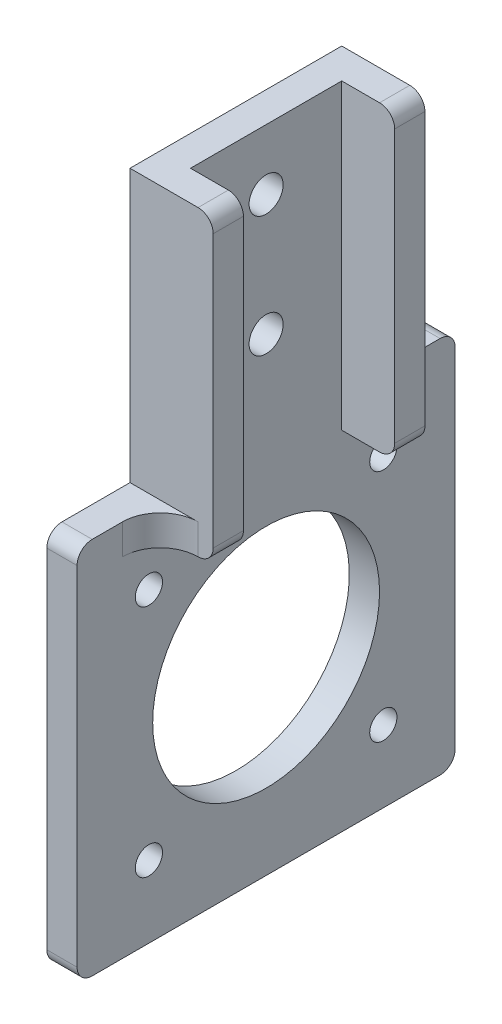
ISO-10303-21;
HEADER;
FILE_DESCRIPTION(('STEP AP214'),'2;1');
FILE_NAME('part.step','',(''),(''),'','','');
FILE_SCHEMA(('AUTOMOTIVE_DESIGN { 1 0 10303 214 1 1 1 1 }'));
ENDSEC;
DATA;
#1=APPLICATION_CONTEXT('core data for automotive mechanical design processes');
#2=APPLICATION_PROTOCOL_DEFINITION('international standard','automotive_design',2000,#1);
#3=PRODUCT_CONTEXT('',#1,'mechanical');
#4=PRODUCT('Part','Part','',(#3));
#5=PRODUCT_RELATED_PRODUCT_CATEGORY('part','',(#4));
#6=PRODUCT_DEFINITION_FORMATION('','',#4);
#7=PRODUCT_DEFINITION_CONTEXT('part definition',#1,'design');
#8=PRODUCT_DEFINITION('design','',#6,#7);
#9=PRODUCT_DEFINITION_SHAPE('','',#8);
#10=(LENGTH_UNIT() NAMED_UNIT(*) SI_UNIT(.MILLI.,.METRE.));
#11=(NAMED_UNIT(*) PLANE_ANGLE_UNIT() SI_UNIT($,.RADIAN.));
#12=(NAMED_UNIT(*) SI_UNIT($,.STERADIAN.) SOLID_ANGLE_UNIT());
#13=UNCERTAINTY_MEASURE_WITH_UNIT(LENGTH_MEASURE(1.E-05),#10,'distance_accuracy_value','');
#14=(GEOMETRIC_REPRESENTATION_CONTEXT(3) GLOBAL_UNCERTAINTY_ASSIGNED_CONTEXT((#13)) GLOBAL_UNIT_ASSIGNED_CONTEXT((#10,
#11,#12)) REPRESENTATION_CONTEXT('',''));
#15=CARTESIAN_POINT('',(0.,0.,0.));
#16=DIRECTION('',(0.,0.,1.));
#17=DIRECTION('',(1.,0.,0.));
#18=AXIS2_PLACEMENT_3D('',#15,#16,#17);
#19=CARTESIAN_POINT('',(0.,0.,0.));
#20=DIRECTION('',(0.,1.,0.));
#21=DIRECTION('',(0.,0.,1.));
#22=AXIS2_PLACEMENT_3D('',#19,#20,#21);
#23=PLANE('',#22);
#24=DIRECTION('',(0.,0.,1.));
#25=VECTOR('',#24,1.);
#26=CARTESIAN_POINT('',(-9.99999999999999,0.,0.));
#27=LINE('',#26,#25);
#28=CARTESIAN_POINT('',(-10.,0.,-19.));
#29=VERTEX_POINT('',#28);
#30=CARTESIAN_POINT('',(-10.,0.,-10.));
#31=VERTEX_POINT('',#30);
#32=EDGE_CURVE('E232',#29,#31,#27,.T.);
#33=ORIENTED_EDGE('',*,*,#32,.F.);
#34=CARTESIAN_POINT('',(-5.,0.,-19.));
#35=DIRECTION('',(0.,1.,0.));
#36=DIRECTION('',(0.,0.,1.));
#37=AXIS2_PLACEMENT_3D('',#34,#35,#36);
#38=CIRCLE('',#37,5.);
#39=CARTESIAN_POINT('',(-5.00000000000001,0.,-14.));
#40=VERTEX_POINT('',#39);
#41=EDGE_CURVE('E420',#29,#40,#38,.T.);
#42=ORIENTED_EDGE('',*,*,#41,.T.);
#43=DIRECTION('',(0.,0.,-1.));
#44=VECTOR('',#43,1.);
#45=CARTESIAN_POINT('',(-5.00000000000001,0.,0.));
#46=LINE('',#45,#44);
#47=CARTESIAN_POINT('',(-5.00000000000001,0.,-10.));
#48=VERTEX_POINT('',#47);
#49=EDGE_CURVE('E316',#40,#48,#46,.F.);
#50=ORIENTED_EDGE('',*,*,#49,.T.);
#51=DIRECTION('',(-1.,0.,0.));
#52=VECTOR('',#51,1.);
#53=CARTESIAN_POINT('',(-10.,0.,-10.));
#54=LINE('',#53,#52);
#55=EDGE_CURVE('E212',#48,#31,#54,.T.);
#56=ORIENTED_EDGE('',*,*,#55,.T.);
#57=EDGE_LOOP('',(#33,#42,#50,#56));
#58=FACE_BOUND('',#57,.T.);
#59=ADVANCED_FACE('F43',(#58),#23,.F.);
#60=CARTESIAN_POINT('',(-14.,40.,-14.));
#61=DIRECTION('',(0.,0.,1.));
#62=DIRECTION('',(1.,0.,0.));
#63=AXIS2_PLACEMENT_3D('',#60,#61,#62);
#64=PLANE('',#63);
#65=CARTESIAN_POINT('',(-5.,2.,-14.));
#66=DIRECTION('',(0.,0.,1.));
#67=DIRECTION('',(1.,0.,0.));
#68=AXIS2_PLACEMENT_3D('',#65,#66,#67);
#69=CIRCLE('',#68,2.);
#70=CARTESIAN_POINT('',(-3.,2.,-14.));
#71=VERTEX_POINT('',#70);
#72=EDGE_CURVE('E312',#71,#40,#69,.F.);
#73=ORIENTED_EDGE('',*,*,#72,.T.);
#74=DIRECTION('',(0.,-1.,0.));
#75=VECTOR('',#74,1.);
#76=CARTESIAN_POINT('',(-5.,40.,-14.));
#77=LINE('',#76,#75);
#78=CARTESIAN_POINT('',(-5.,4.,-14.));
#79=VERTEX_POINT('',#78);
#80=EDGE_CURVE('E414',#40,#79,#77,.F.);
#81=ORIENTED_EDGE('',*,*,#80,.T.);
#82=DIRECTION('',(-1.,0.,0.));
#83=VECTOR('',#82,1.);
#84=CARTESIAN_POINT('',(60.7106781186548,4.,-14.));
#85=LINE('',#84,#83);
#86=CARTESIAN_POINT('',(-14.,4.,-14.));
#87=VERTEX_POINT('',#86);
#88=EDGE_CURVE('E67',#79,#87,#85,.T.);
#89=ORIENTED_EDGE('',*,*,#88,.T.);
#90=DIRECTION('',(0.,-1.,0.));
#91=VECTOR('',#90,1.);
#92=CARTESIAN_POINT('',(-14.,40.,-14.));
#93=LINE('',#92,#91);
#94=CARTESIAN_POINT('',(-14.,40.,-14.));
#95=VERTEX_POINT('',#94);
#96=EDGE_CURVE('E288',#95,#87,#93,.T.);
#97=ORIENTED_EDGE('',*,*,#96,.F.);
#98=DIRECTION('',(-1.,0.,0.));
#99=VECTOR('',#98,1.);
#100=CARTESIAN_POINT('',(-14.,40.,-14.));
#101=LINE('',#100,#99);
#102=CARTESIAN_POINT('',(-5.00000000000001,40.,-14.));
#103=VERTEX_POINT('',#102);
#104=EDGE_CURVE('E275',#103,#95,#101,.T.);
#105=ORIENTED_EDGE('',*,*,#104,.F.);
#106=CARTESIAN_POINT('',(-5.,38.,-14.));
#107=DIRECTION('',(0.,0.,1.));
#108=DIRECTION('',(1.,0.,0.));
#109=AXIS2_PLACEMENT_3D('',#106,#107,#108);
#110=CIRCLE('',#109,2.);
#111=CARTESIAN_POINT('',(-3.,38.,-14.));
#112=VERTEX_POINT('',#111);
#113=EDGE_CURVE('E309',#103,#112,#110,.F.);
#114=ORIENTED_EDGE('',*,*,#113,.T.);
#115=DIRECTION('',(0.,-1.,0.));
#116=VECTOR('',#115,1.);
#117=CARTESIAN_POINT('',(-3.,40.,-14.));
#118=LINE('',#117,#116);
#119=EDGE_CURVE('E455',#112,#71,#118,.T.);
#120=ORIENTED_EDGE('',*,*,#119,.T.);
#121=EDGE_LOOP('',(#73,#81,#89,#97,#105,#114,#120));
#122=FACE_BOUND('',#121,.T.);
#123=ADVANCED_FACE('F566',(#122),#64,.F.);
#124=CARTESIAN_POINT('',(-14.,40.,14.));
#125=DIRECTION('',(0.,0.,-1.));
#126=DIRECTION('',(-1.,0.,0.));
#127=AXIS2_PLACEMENT_3D('',#124,#125,#126);
#128=PLANE('',#127);
#129=DIRECTION('',(-1.,0.,0.));
#130=VECTOR('',#129,1.);
#131=CARTESIAN_POINT('',(60.7106781186548,4.,14.));
#132=LINE('',#131,#130);
#133=CARTESIAN_POINT('',(-5.,4.,14.));
#134=VERTEX_POINT('',#133);
#135=CARTESIAN_POINT('',(-14.,4.,14.));
#136=VERTEX_POINT('',#135);
#137=EDGE_CURVE('E59',#134,#136,#132,.T.);
#138=ORIENTED_EDGE('',*,*,#137,.F.);
#139=DIRECTION('',(0.,1.,0.));
#140=VECTOR('',#139,1.);
#141=CARTESIAN_POINT('',(-5.,40.,14.));
#142=LINE('',#141,#140);
#143=CARTESIAN_POINT('',(-5.00000000000001,0.,14.));
#144=VERTEX_POINT('',#143);
#145=EDGE_CURVE('E417',#134,#144,#142,.F.);
#146=ORIENTED_EDGE('',*,*,#145,.T.);
#147=CARTESIAN_POINT('',(-5.00000000000001,2.,14.));
#148=DIRECTION('',(0.,0.,-1.));
#149=DIRECTION('',(-1.,0.,0.));
#150=AXIS2_PLACEMENT_3D('',#147,#148,#149);
#151=CIRCLE('',#150,2.);
#152=CARTESIAN_POINT('',(-3.00000000000001,2.,14.));
#153=VERTEX_POINT('',#152);
#154=EDGE_CURVE('E343',#144,#153,#151,.F.);
#155=ORIENTED_EDGE('',*,*,#154,.T.);
#156=DIRECTION('',(0.,-1.,0.));
#157=VECTOR('',#156,1.);
#158=CARTESIAN_POINT('',(-3.00000000000001,40.,14.));
#159=LINE('',#158,#157);
#160=CARTESIAN_POINT('',(-3.00000000000001,38.,14.));
#161=VERTEX_POINT('',#160);
#162=EDGE_CURVE('E443',#161,#153,#159,.T.);
#163=ORIENTED_EDGE('',*,*,#162,.F.);
#164=CARTESIAN_POINT('',(-5.00000000000001,38.,14.));
#165=DIRECTION('',(0.,0.,-1.));
#166=DIRECTION('',(-1.,0.,0.));
#167=AXIS2_PLACEMENT_3D('',#164,#165,#166);
#168=CIRCLE('',#167,2.);
#169=CARTESIAN_POINT('',(-5.00000000000001,40.,14.));
#170=VERTEX_POINT('',#169);
#171=EDGE_CURVE('E340',#161,#170,#168,.F.);
#172=ORIENTED_EDGE('',*,*,#171,.T.);
#173=DIRECTION('',(1.,0.,0.));
#174=VECTOR('',#173,1.);
#175=CARTESIAN_POINT('',(-14.,40.,14.));
#176=LINE('',#175,#174);
#177=CARTESIAN_POINT('',(-14.,40.,14.));
#178=VERTEX_POINT('',#177);
#179=EDGE_CURVE('E281',#178,#170,#176,.T.);
#180=ORIENTED_EDGE('',*,*,#179,.F.);
#181=DIRECTION('',(0.,-1.,0.));
#182=VECTOR('',#181,1.);
#183=CARTESIAN_POINT('',(-14.,40.,14.));
#184=LINE('',#183,#182);
#185=EDGE_CURVE('E285',#178,#136,#184,.T.);
#186=ORIENTED_EDGE('',*,*,#185,.T.);
#187=EDGE_LOOP('',(#138,#146,#155,#163,#172,#180,#186));
#188=FACE_BOUND('',#187,.T.);
#189=ADVANCED_FACE('F433',(#188),#128,.F.);
#190=CARTESIAN_POINT('',(0.,40.,0.));
#191=DIRECTION('',(0.,1.,0.));
#192=DIRECTION('',(0.,0.,1.));
#193=AXIS2_PLACEMENT_3D('',#190,#191,#192);
#194=PLANE('',#193);
#195=DIRECTION('',(-1.,0.,0.));
#196=VECTOR('',#195,1.);
#197=CARTESIAN_POINT('',(-10.,40.,-10.));
#198=LINE('',#197,#196);
#199=CARTESIAN_POINT('',(-5.00000000000001,40.,-10.));
#200=VERTEX_POINT('',#199);
#201=CARTESIAN_POINT('',(-10.,40.,-10.));
#202=VERTEX_POINT('',#201);
#203=EDGE_CURVE('E211',#200,#202,#198,.T.);
#204=ORIENTED_EDGE('',*,*,#203,.F.);
#205=DIRECTION('',(0.,0.,-1.));
#206=VECTOR('',#205,1.);
#207=CARTESIAN_POINT('',(-5.,40.,-14.));
#208=LINE('',#207,#206);
#209=EDGE_CURVE('E350',#200,#103,#208,.T.);
#210=ORIENTED_EDGE('',*,*,#209,.T.);
#211=ORIENTED_EDGE('',*,*,#104,.T.);
#212=DIRECTION('',(0.,0.,1.));
#213=VECTOR('',#212,1.);
#214=CARTESIAN_POINT('',(-14.,40.,-14.));
#215=LINE('',#214,#213);
#216=EDGE_CURVE('E278',#95,#178,#215,.T.);
#217=ORIENTED_EDGE('',*,*,#216,.T.);
#218=ORIENTED_EDGE('',*,*,#179,.T.);
#219=DIRECTION('',(0.,0.,-1.));
#220=VECTOR('',#219,1.);
#221=CARTESIAN_POINT('',(-5.00000000000001,40.,10.));
#222=LINE('',#221,#220);
#223=CARTESIAN_POINT('',(-5.00000000000001,40.,10.));
#224=VERTEX_POINT('',#223);
#225=EDGE_CURVE('E346',#170,#224,#222,.T.);
#226=ORIENTED_EDGE('',*,*,#225,.T.);
#227=DIRECTION('',(1.,0.,0.));
#228=VECTOR('',#227,1.);
#229=CARTESIAN_POINT('',(-10.,40.,10.));
#230=LINE('',#229,#228);
#231=CARTESIAN_POINT('',(-10.,40.,10.));
#232=VERTEX_POINT('',#231);
#233=EDGE_CURVE('E226',#232,#224,#230,.T.);
#234=ORIENTED_EDGE('',*,*,#233,.F.);
#235=DIRECTION('',(0.,0.,1.));
#236=VECTOR('',#235,1.);
#237=CARTESIAN_POINT('',(-10.,40.,10.));
#238=LINE('',#237,#236);
#239=EDGE_CURVE('E222',#202,#232,#238,.T.);
#240=ORIENTED_EDGE('',*,*,#239,.F.);
#241=EDGE_LOOP('',(#204,#210,#211,#217,#218,#226,#234,#240));
#242=FACE_BOUND('',#241,.T.);
#243=ADVANCED_FACE('F450',(#242),#194,.T.);
#244=DIRECTION('',(1.,0.,0.));
#245=VECTOR('',#244,1.);
#246=CARTESIAN_POINT('',(-10.,0.,10.));
#247=LINE('',#246,#245);
#248=CARTESIAN_POINT('',(-9.99999999999999,0.,10.));
#249=VERTEX_POINT('',#248);
#250=CARTESIAN_POINT('',(-5.00000000000001,0.,10.));
#251=VERTEX_POINT('',#250);
#252=EDGE_CURVE('E198',#249,#251,#247,.T.);
#253=ORIENTED_EDGE('',*,*,#252,.T.);
#254=DIRECTION('',(0.,0.,-1.));
#255=VECTOR('',#254,1.);
#256=CARTESIAN_POINT('',(-5.00000000000001,0.,0.));
#257=LINE('',#256,#255);
#258=EDGE_CURVE('E337',#251,#144,#257,.F.);
#259=ORIENTED_EDGE('',*,*,#258,.T.);
#260=CARTESIAN_POINT('',(-5.,0.,19.));
#261=DIRECTION('',(0.,1.,0.));
#262=DIRECTION('',(0.,0.,1.));
#263=AXIS2_PLACEMENT_3D('',#260,#261,#262);
#264=CIRCLE('',#263,5.);
#265=CARTESIAN_POINT('',(-9.99999999999999,0.,19.));
#266=VERTEX_POINT('',#265);
#267=EDGE_CURVE('E11',#144,#266,#264,.T.);
#268=ORIENTED_EDGE('',*,*,#267,.T.);
#269=EDGE_CURVE('E219',#249,#266,#27,.T.);
#270=ORIENTED_EDGE('',*,*,#269,.F.);
#271=EDGE_LOOP('',(#253,#259,#268,#270));
#272=FACE_BOUND('',#271,.T.);
#273=ADVANCED_FACE('F228',(#272),#23,.F.);
#274=CARTESIAN_POINT('',(-14.,40.,-14.));
#275=DIRECTION('',(1.,0.,0.));
#276=DIRECTION('',(0.,0.,-1.));
#277=AXIS2_PLACEMENT_3D('',#274,#275,#276);
#278=PLANE('',#277);
#279=CARTESIAN_POINT('',(-14.,16.,0.));
#280=DIRECTION('',(-1.,0.,0.));
#281=DIRECTION('',(0.,0.,1.));
#282=AXIS2_PLACEMENT_3D('',#279,#280,#281);
#283=CIRCLE('',#282,2.25);
#284=CARTESIAN_POINT('',(-14.,16.,2.25));
#285=VERTEX_POINT('',#284);
#286=EDGE_CURVE('E253',#285,#285,#283,.T.);
#287=ORIENTED_EDGE('',*,*,#286,.F.);
#288=EDGE_LOOP('',(#287));
#289=FACE_BOUND('',#288,.T.);
#290=CARTESIAN_POINT('',(-14.,32.,0.));
#291=DIRECTION('',(-1.,0.,0.));
#292=DIRECTION('',(0.,0.,1.));
#293=AXIS2_PLACEMENT_3D('',#290,#291,#292);
#294=CIRCLE('',#293,2.25);
#295=CARTESIAN_POINT('',(-14.,32.,2.25));
#296=VERTEX_POINT('',#295);
#297=EDGE_CURVE('E258',#296,#296,#294,.T.);
#298=ORIENTED_EDGE('',*,*,#297,.F.);
#299=EDGE_LOOP('',(#298));
#300=FACE_BOUND('',#299,.T.);
#301=DIRECTION('',(0.,1.,0.));
#302=VECTOR('',#301,1.);
#303=CARTESIAN_POINT('',(-14.,0.,25.));
#304=LINE('',#303,#302);
#305=CARTESIAN_POINT('',(-14.,-44.,25.));
#306=VERTEX_POINT('',#305);
#307=CARTESIAN_POINT('',(-14.,2.,25.));
#308=VERTEX_POINT('',#307);
#309=EDGE_CURVE('E240',#306,#308,#304,.T.);
#310=ORIENTED_EDGE('',*,*,#309,.T.);
#311=CARTESIAN_POINT('',(-14.,2.,23.));
#312=DIRECTION('',(1.,0.,0.));
#313=DIRECTION('',(0.,0.,-1.));
#314=AXIS2_PLACEMENT_3D('',#311,#312,#313);
#315=CIRCLE('',#314,2.);
#316=CARTESIAN_POINT('',(-14.,4.,23.));
#317=VERTEX_POINT('',#316);
#318=EDGE_CURVE('E370',#308,#317,#315,.F.);
#319=ORIENTED_EDGE('',*,*,#318,.T.);
#320=DIRECTION('',(0.,0.,1.));
#321=VECTOR('',#320,1.);
#322=CARTESIAN_POINT('',(-14.,4.,0.));
#323=LINE('',#322,#321);
#324=EDGE_CURVE('E247',#136,#317,#323,.T.);
#325=ORIENTED_EDGE('',*,*,#324,.F.);
#326=ORIENTED_EDGE('',*,*,#185,.F.);
#327=ORIENTED_EDGE('',*,*,#216,.F.);
#328=ORIENTED_EDGE('',*,*,#96,.T.);
#329=CARTESIAN_POINT('',(-14.,4.,-23.));
#330=VERTEX_POINT('',#329);
#331=EDGE_CURVE('E252',#330,#87,#323,.T.);
#332=ORIENTED_EDGE('',*,*,#331,.F.);
#333=CARTESIAN_POINT('',(-14.,2.,-23.));
#334=DIRECTION('',(1.,0.,0.));
#335=DIRECTION('',(0.,0.,-1.));
#336=AXIS2_PLACEMENT_3D('',#333,#334,#335);
#337=CIRCLE('',#336,2.);
#338=CARTESIAN_POINT('',(-14.,2.,-25.));
#339=VERTEX_POINT('',#338);
#340=EDGE_CURVE('E367',#330,#339,#337,.F.);
#341=ORIENTED_EDGE('',*,*,#340,.T.);
#342=DIRECTION('',(0.,1.,0.));
#343=VECTOR('',#342,1.);
#344=CARTESIAN_POINT('',(-14.,0.,-25.));
#345=LINE('',#344,#343);
#346=CARTESIAN_POINT('',(-14.,-44.,-25.));
#347=VERTEX_POINT('',#346);
#348=EDGE_CURVE('E487',#347,#339,#345,.T.);
#349=ORIENTED_EDGE('',*,*,#348,.F.);
#350=CARTESIAN_POINT('',(-14.,-44.,-23.));
#351=DIRECTION('',(1.,0.,0.));
#352=DIRECTION('',(0.,0.,-1.));
#353=AXIS2_PLACEMENT_3D('',#350,#351,#352);
#354=CIRCLE('',#353,2.);
#355=CARTESIAN_POINT('',(-14.,-46.,-23.));
#356=VERTEX_POINT('',#355);
#357=EDGE_CURVE('E364',#347,#356,#354,.F.);
#358=ORIENTED_EDGE('',*,*,#357,.T.);
#359=DIRECTION('',(0.,0.,1.));
#360=VECTOR('',#359,1.);
#361=CARTESIAN_POINT('',(-14.,-46.,0.));
#362=LINE('',#361,#360);
#363=CARTESIAN_POINT('',(-14.,-46.,23.));
#364=VERTEX_POINT('',#363);
#365=EDGE_CURVE('E468',#356,#364,#362,.T.);
#366=ORIENTED_EDGE('',*,*,#365,.T.);
#367=CARTESIAN_POINT('',(-14.,-44.,23.));
#368=DIRECTION('',(1.,0.,0.));
#369=DIRECTION('',(0.,0.,-1.));
#370=AXIS2_PLACEMENT_3D('',#367,#368,#369);
#371=CIRCLE('',#370,2.);
#372=EDGE_CURVE('E361',#364,#306,#371,.F.);
#373=ORIENTED_EDGE('',*,*,#372,.T.);
#374=EDGE_LOOP('',(#310,#319,#325,#326,#327,#328,#332,#341,#349,#358,#366,#373));
#375=FACE_BOUND('',#374,.T.);
#376=CARTESIAN_POINT('',(-14.,-21.,0.));
#377=DIRECTION('',(-1.,0.,0.));
#378=DIRECTION('',(0.,0.,1.));
#379=AXIS2_PLACEMENT_3D('',#376,#377,#378);
#380=CIRCLE('',#379,15.);
#381=CARTESIAN_POINT('',(-14.,-21.,15.));
#382=VERTEX_POINT('',#381);
#383=EDGE_CURVE('E469',#382,#382,#380,.T.);
#384=ORIENTED_EDGE('',*,*,#383,.F.);
#385=EDGE_LOOP('',(#384));
#386=FACE_BOUND('',#385,.T.);
#387=CARTESIAN_POINT('',(-14.,-36.4997806436091,-15.4997806436091));
#388=DIRECTION('',(-1.,0.,0.));
#389=DIRECTION('',(0.,0.,1.));
#390=AXIS2_PLACEMENT_3D('',#387,#388,#389);
#391=CIRCLE('',#390,1.8);
#392=CARTESIAN_POINT('',(-14.,-36.4997806436091,-13.6997806436091));
#393=VERTEX_POINT('',#392);
#394=EDGE_CURVE('E477',#393,#393,#391,.T.);
#395=ORIENTED_EDGE('',*,*,#394,.F.);
#396=EDGE_LOOP('',(#395));
#397=FACE_BOUND('',#396,.T.);
#398=CARTESIAN_POINT('',(-14.,-36.4997806436091,15.4997806436091));
#399=DIRECTION('',(-1.,0.,0.));
#400=DIRECTION('',(0.,0.,1.));
#401=AXIS2_PLACEMENT_3D('',#398,#399,#400);
#402=CIRCLE('',#401,1.8);
#403=CARTESIAN_POINT('',(-14.,-36.4997806436091,17.2997806436091));
#404=VERTEX_POINT('',#403);
#405=EDGE_CURVE('E473',#404,#404,#402,.T.);
#406=ORIENTED_EDGE('',*,*,#405,.F.);
#407=EDGE_LOOP('',(#406));
#408=FACE_BOUND('',#407,.T.);
#409=CARTESIAN_POINT('',(-14.,-5.50021935639087,15.4997806436091));
#410=DIRECTION('',(-1.,0.,0.));
#411=DIRECTION('',(0.,0.,1.));
#412=AXIS2_PLACEMENT_3D('',#409,#410,#411);
#413=CIRCLE('',#412,1.8);
#414=CARTESIAN_POINT('',(-14.,-5.50021935639087,17.2997806436091));
#415=VERTEX_POINT('',#414);
#416=EDGE_CURVE('E251',#415,#415,#413,.T.);
#417=ORIENTED_EDGE('',*,*,#416,.F.);
#418=EDGE_LOOP('',(#417));
#419=FACE_BOUND('',#418,.T.);
#420=CARTESIAN_POINT('',(-14.,-5.50021935639087,-15.4997806436091));
#421=DIRECTION('',(-1.,0.,0.));
#422=DIRECTION('',(0.,0.,1.));
#423=AXIS2_PLACEMENT_3D('',#420,#421,#422);
#424=CIRCLE('',#423,1.8);
#425=CARTESIAN_POINT('',(-14.,-5.50021935639087,-13.6997806436091));
#426=VERTEX_POINT('',#425);
#427=EDGE_CURVE('E464',#426,#426,#424,.T.);
#428=ORIENTED_EDGE('',*,*,#427,.F.);
#429=EDGE_LOOP('',(#428));
#430=FACE_BOUND('',#429,.T.);
#431=ADVANCED_FACE('F544',(#289,#300,#375,#386,#397,#408,#419,#430),#278,.F.);
#432=CARTESIAN_POINT('',(-10.,40.,-10.));
#433=DIRECTION('',(0.,0.,1.));
#434=DIRECTION('',(1.,0.,0.));
#435=AXIS2_PLACEMENT_3D('',#432,#433,#434);
#436=PLANE('',#435);
#437=ORIENTED_EDGE('',*,*,#55,.F.);
#438=CARTESIAN_POINT('',(-5.00000000000001,2.,-10.));
#439=DIRECTION('',(0.,0.,1.));
#440=DIRECTION('',(1.,0.,0.));
#441=AXIS2_PLACEMENT_3D('',#438,#439,#440);
#442=CIRCLE('',#441,2.);
#443=CARTESIAN_POINT('',(-3.00000000000001,2.,-10.));
#444=VERTEX_POINT('',#443);
#445=EDGE_CURVE('E322',#48,#444,#442,.T.);
#446=ORIENTED_EDGE('',*,*,#445,.T.);
#447=DIRECTION('',(0.,-1.,0.));
#448=VECTOR('',#447,1.);
#449=CARTESIAN_POINT('',(-3.00000000000001,40.,-10.));
#450=LINE('',#449,#448);
#451=CARTESIAN_POINT('',(-3.00000000000001,38.,-10.));
#452=VERTEX_POINT('',#451);
#453=EDGE_CURVE('E248',#452,#444,#450,.T.);
#454=ORIENTED_EDGE('',*,*,#453,.F.);
#455=CARTESIAN_POINT('',(-5.00000000000001,38.,-10.));
#456=DIRECTION('',(0.,0.,1.));
#457=DIRECTION('',(1.,0.,0.));
#458=AXIS2_PLACEMENT_3D('',#455,#456,#457);
#459=CIRCLE('',#458,2.);
#460=EDGE_CURVE('E319',#452,#200,#459,.T.);
#461=ORIENTED_EDGE('',*,*,#460,.T.);
#462=ORIENTED_EDGE('',*,*,#203,.T.);
#463=DIRECTION('',(0.,-1.,0.));
#464=VECTOR('',#463,1.);
#465=CARTESIAN_POINT('',(-10.,40.,-10.));
#466=LINE('',#465,#464);
#467=EDGE_CURVE('E225',#202,#31,#466,.T.);
#468=ORIENTED_EDGE('',*,*,#467,.T.);
#469=EDGE_LOOP('',(#437,#446,#454,#461,#462,#468));
#470=FACE_BOUND('',#469,.T.);
#471=ADVANCED_FACE('F578',(#470),#436,.T.);
#472=CARTESIAN_POINT('',(-10.,40.,10.));
#473=DIRECTION('',(1.,0.,0.));
#474=DIRECTION('',(0.,0.,-1.));
#475=AXIS2_PLACEMENT_3D('',#472,#473,#474);
#476=PLANE('',#475);
#477=CARTESIAN_POINT('',(-10.,16.,0.));
#478=DIRECTION('',(1.,0.,0.));
#479=DIRECTION('',(0.,0.,-1.));
#480=AXIS2_PLACEMENT_3D('',#477,#478,#479);
#481=CIRCLE('',#480,2.25);
#482=CARTESIAN_POINT('',(-10.,16.,-2.25));
#483=VERTEX_POINT('',#482);
#484=EDGE_CURVE('E270',#483,#483,#481,.T.);
#485=ORIENTED_EDGE('',*,*,#484,.F.);
#486=EDGE_LOOP('',(#485));
#487=FACE_BOUND('',#486,.T.);
#488=CARTESIAN_POINT('',(-10.,32.,0.));
#489=DIRECTION('',(1.,0.,0.));
#490=DIRECTION('',(0.,0.,-1.));
#491=AXIS2_PLACEMENT_3D('',#488,#489,#490);
#492=CIRCLE('',#491,2.25);
#493=CARTESIAN_POINT('',(-10.,32.,-2.25));
#494=VERTEX_POINT('',#493);
#495=EDGE_CURVE('E257',#494,#494,#492,.T.);
#496=ORIENTED_EDGE('',*,*,#495,.F.);
#497=EDGE_LOOP('',(#496));
#498=FACE_BOUND('',#497,.T.);
#499=DIRECTION('',(0.,0.,1.));
#500=VECTOR('',#499,1.);
#501=CARTESIAN_POINT('',(-9.99999999999999,4.,0.));
#502=LINE('',#501,#500);
#503=CARTESIAN_POINT('',(-10.,4.,-23.));
#504=VERTEX_POINT('',#503);
#505=CARTESIAN_POINT('',(-10.,4.,-19.));
#506=VERTEX_POINT('',#505);
#507=EDGE_CURVE('E511',#504,#506,#502,.T.);
#508=ORIENTED_EDGE('',*,*,#507,.T.);
#509=DIRECTION('',(0.,-1.,0.));
#510=VECTOR('',#509,1.);
#511=CARTESIAN_POINT('',(-10.,40.,-19.));
#512=LINE('',#511,#510);
#513=EDGE_CURVE('E410',#506,#29,#512,.T.);
#514=ORIENTED_EDGE('',*,*,#513,.T.);
#515=ORIENTED_EDGE('',*,*,#32,.T.);
#516=ORIENTED_EDGE('',*,*,#467,.F.);
#517=ORIENTED_EDGE('',*,*,#239,.T.);
#518=DIRECTION('',(0.,-1.,0.));
#519=VECTOR('',#518,1.);
#520=CARTESIAN_POINT('',(-10.,40.,10.));
#521=LINE('',#520,#519);
#522=EDGE_CURVE('E203',#232,#249,#521,.T.);
#523=ORIENTED_EDGE('',*,*,#522,.T.);
#524=ORIENTED_EDGE('',*,*,#269,.T.);
#525=DIRECTION('',(0.,1.,0.));
#526=VECTOR('',#525,1.);
#527=CARTESIAN_POINT('',(-10.,40.,19.));
#528=LINE('',#527,#526);
#529=CARTESIAN_POINT('',(-9.99999999999999,4.,19.));
#530=VERTEX_POINT('',#529);
#531=EDGE_CURVE('E407',#266,#530,#528,.T.);
#532=ORIENTED_EDGE('',*,*,#531,.T.);
#533=DIRECTION('',(0.,0.,1.));
#534=VECTOR('',#533,1.);
#535=CARTESIAN_POINT('',(-9.99999999999999,4.,0.));
#536=LINE('',#535,#534);
#537=CARTESIAN_POINT('',(-9.99999999999999,4.,23.));
#538=VERTEX_POINT('',#537);
#539=EDGE_CURVE('E238',#530,#538,#536,.T.);
#540=ORIENTED_EDGE('',*,*,#539,.T.);
#541=CARTESIAN_POINT('',(-10.,2.,23.));
#542=DIRECTION('',(1.,0.,0.));
#543=DIRECTION('',(0.,0.,-1.));
#544=AXIS2_PLACEMENT_3D('',#541,#542,#543);
#545=CIRCLE('',#544,2.);
#546=CARTESIAN_POINT('',(-10.,2.,25.));
#547=VERTEX_POINT('',#546);
#548=EDGE_CURVE('E386',#538,#547,#545,.T.);
#549=ORIENTED_EDGE('',*,*,#548,.T.);
#550=DIRECTION('',(0.,1.,0.));
#551=VECTOR('',#550,1.);
#552=CARTESIAN_POINT('',(-10.,0.,25.));
#553=LINE('',#552,#551);
#554=CARTESIAN_POINT('',(-10.,-44.,25.));
#555=VERTEX_POINT('',#554);
#556=EDGE_CURVE('E521',#555,#547,#553,.T.);
#557=ORIENTED_EDGE('',*,*,#556,.F.);
#558=CARTESIAN_POINT('',(-9.99999999999999,-44.,23.));
#559=DIRECTION('',(1.,0.,0.));
#560=DIRECTION('',(0.,0.,-1.));
#561=AXIS2_PLACEMENT_3D('',#558,#559,#560);
#562=CIRCLE('',#561,2.);
#563=CARTESIAN_POINT('',(-9.99999999999999,-46.,23.));
#564=VERTEX_POINT('',#563);
#565=EDGE_CURVE('E377',#555,#564,#562,.T.);
#566=ORIENTED_EDGE('',*,*,#565,.T.);
#567=DIRECTION('',(0.,0.,1.));
#568=VECTOR('',#567,1.);
#569=CARTESIAN_POINT('',(-9.99999999999999,-46.,0.));
#570=LINE('',#569,#568);
#571=CARTESIAN_POINT('',(-10.,-46.,-23.));
#572=VERTEX_POINT('',#571);
#573=EDGE_CURVE('E491',#572,#564,#570,.T.);
#574=ORIENTED_EDGE('',*,*,#573,.F.);
#575=CARTESIAN_POINT('',(-9.99999999999999,-44.,-23.));
#576=DIRECTION('',(1.,0.,0.));
#577=DIRECTION('',(0.,0.,-1.));
#578=AXIS2_PLACEMENT_3D('',#575,#576,#577);
#579=CIRCLE('',#578,2.);
#580=CARTESIAN_POINT('',(-9.99999999999999,-44.,-25.));
#581=VERTEX_POINT('',#580);
#582=EDGE_CURVE('E380',#572,#581,#579,.T.);
#583=ORIENTED_EDGE('',*,*,#582,.T.);
#584=DIRECTION('',(0.,1.,0.));
#585=VECTOR('',#584,1.);
#586=CARTESIAN_POINT('',(-9.99999999999999,0.,-25.));
#587=LINE('',#586,#585);
#588=CARTESIAN_POINT('',(-9.99999999999999,2.,-25.));
#589=VERTEX_POINT('',#588);
#590=EDGE_CURVE('E515',#581,#589,#587,.T.);
#591=ORIENTED_EDGE('',*,*,#590,.T.);
#592=CARTESIAN_POINT('',(-9.99999999999999,2.,-23.));
#593=DIRECTION('',(1.,0.,0.));
#594=DIRECTION('',(0.,0.,-1.));
#595=AXIS2_PLACEMENT_3D('',#592,#593,#594);
#596=CIRCLE('',#595,2.);
#597=EDGE_CURVE('E383',#589,#504,#596,.T.);
#598=ORIENTED_EDGE('',*,*,#597,.T.);
#599=EDGE_LOOP('',(#508,#514,#515,#516,#517,#523,#524,#532,#540,#549,#557,#566,#574,#583,#591,#598));
#600=FACE_BOUND('',#599,.T.);
#601=CARTESIAN_POINT('',(-9.99999999999999,-36.4997806436091,15.4997806436091));
#602=DIRECTION('',(1.,0.,0.));
#603=DIRECTION('',(0.,0.,-1.));
#604=AXIS2_PLACEMENT_3D('',#601,#602,#603);
#605=CIRCLE('',#604,1.8);
#606=CARTESIAN_POINT('',(-9.99999999999999,-36.4997806436091,13.6997806436091));
#607=VERTEX_POINT('',#606);
#608=EDGE_CURVE('E233',#607,#607,#605,.F.);
#609=ORIENTED_EDGE('',*,*,#608,.T.);
#610=EDGE_LOOP('',(#609));
#611=FACE_BOUND('',#610,.T.);
#612=CARTESIAN_POINT('',(-9.99999999999999,-5.50021935639087,-15.4997806436091));
#613=DIRECTION('',(1.,0.,0.));
#614=DIRECTION('',(0.,0.,-1.));
#615=AXIS2_PLACEMENT_3D('',#612,#613,#614);
#616=CIRCLE('',#615,1.8);
#617=CARTESIAN_POINT('',(-9.99999999999999,-5.50021935639087,-17.2997806436091));
#618=VERTEX_POINT('',#617);
#619=EDGE_CURVE('E508',#618,#618,#616,.F.);
#620=ORIENTED_EDGE('',*,*,#619,.T.);
#621=EDGE_LOOP('',(#620));
#622=FACE_BOUND('',#621,.T.);
#623=CARTESIAN_POINT('',(-9.99999999999999,-21.,0.));
#624=DIRECTION('',(1.,0.,0.));
#625=DIRECTION('',(0.,0.,-1.));
#626=AXIS2_PLACEMENT_3D('',#623,#624,#625);
#627=CIRCLE('',#626,15.);
#628=CARTESIAN_POINT('',(-10.,-21.,-15.));
#629=VERTEX_POINT('',#628);
#630=EDGE_CURVE('E504',#629,#629,#627,.F.);
#631=ORIENTED_EDGE('',*,*,#630,.T.);
#632=EDGE_LOOP('',(#631));
#633=FACE_BOUND('',#632,.T.);
#634=CARTESIAN_POINT('',(-9.99999999999999,-36.4997806436091,-15.4997806436091));
#635=DIRECTION('',(1.,0.,0.));
#636=DIRECTION('',(0.,0.,-1.));
#637=AXIS2_PLACEMENT_3D('',#634,#635,#636);
#638=CIRCLE('',#637,1.8);
#639=CARTESIAN_POINT('',(-9.99999999999999,-36.4997806436091,-17.2997806436091));
#640=VERTEX_POINT('',#639);
#641=EDGE_CURVE('E500',#640,#640,#638,.F.);
#642=ORIENTED_EDGE('',*,*,#641,.T.);
#643=EDGE_LOOP('',(#642));
#644=FACE_BOUND('',#643,.T.);
#645=CARTESIAN_POINT('',(-9.99999999999999,-5.50021935639087,15.4997806436091));
#646=DIRECTION('',(1.,0.,0.));
#647=DIRECTION('',(0.,0.,-1.));
#648=AXIS2_PLACEMENT_3D('',#645,#646,#647);
#649=CIRCLE('',#648,1.8);
#650=CARTESIAN_POINT('',(-9.99999999999999,-5.50021935639087,13.6997806436091));
#651=VERTEX_POINT('',#650);
#652=EDGE_CURVE('E262',#651,#651,#649,.F.);
#653=ORIENTED_EDGE('',*,*,#652,.T.);
#654=EDGE_LOOP('',(#653));
#655=FACE_BOUND('',#654,.T.);
#656=ADVANCED_FACE('F216',(#487,#498,#600,#611,#622,#633,#644,#655),#476,.T.);
#657=CARTESIAN_POINT('',(-10.,40.,10.));
#658=DIRECTION('',(0.,0.,-1.));
#659=DIRECTION('',(-1.,0.,0.));
#660=AXIS2_PLACEMENT_3D('',#657,#658,#659);
#661=PLANE('',#660);
#662=DIRECTION('',(0.,1.,0.));
#663=VECTOR('',#662,1.);
#664=CARTESIAN_POINT('',(-3.00000000000001,40.,10.));
#665=LINE('',#664,#663);
#666=CARTESIAN_POINT('',(-3.00000000000001,2.,10.));
#667=VERTEX_POINT('',#666);
#668=CARTESIAN_POINT('',(-3.00000000000001,38.,10.));
#669=VERTEX_POINT('',#668);
#670=EDGE_CURVE('E292',#667,#669,#665,.T.);
#671=ORIENTED_EDGE('',*,*,#670,.F.);
#672=CARTESIAN_POINT('',(-5.00000000000001,2.,10.));
#673=DIRECTION('',(0.,0.,-1.));
#674=DIRECTION('',(-1.,0.,0.));
#675=AXIS2_PLACEMENT_3D('',#672,#673,#674);
#676=CIRCLE('',#675,2.);
#677=EDGE_CURVE('E205',#667,#251,#676,.T.);
#678=ORIENTED_EDGE('',*,*,#677,.T.);
#679=ORIENTED_EDGE('',*,*,#252,.F.);
#680=ORIENTED_EDGE('',*,*,#522,.F.);
#681=ORIENTED_EDGE('',*,*,#233,.T.);
#682=CARTESIAN_POINT('',(-5.00000000000001,38.,10.));
#683=DIRECTION('',(0.,0.,-1.));
#684=DIRECTION('',(-1.,0.,0.));
#685=AXIS2_PLACEMENT_3D('',#682,#683,#684);
#686=CIRCLE('',#685,2.);
#687=EDGE_CURVE('E332',#224,#669,#686,.T.);
#688=ORIENTED_EDGE('',*,*,#687,.T.);
#689=EDGE_LOOP('',(#671,#678,#679,#680,#681,#688));
#690=FACE_BOUND('',#689,.T.);
#691=ADVANCED_FACE('F201',(#690),#661,.T.);
#692=CARTESIAN_POINT('',(16.,32.,0.));
#693=DIRECTION('',(-1.,0.,0.));
#694=DIRECTION('',(0.,0.,1.));
#695=AXIS2_PLACEMENT_3D('',#692,#693,#694);
#696=CYLINDRICAL_SURFACE('',#695,2.25);
#697=ORIENTED_EDGE('',*,*,#495,.T.);
#698=EDGE_LOOP('',(#697));
#699=FACE_BOUND('',#698,.T.);
#700=ORIENTED_EDGE('',*,*,#297,.T.);
#701=EDGE_LOOP('',(#700));
#702=FACE_BOUND('',#701,.T.);
#703=ADVANCED_FACE('F625',(#699,#702),#696,.F.);
#704=CARTESIAN_POINT('',(16.,16.,0.));
#705=DIRECTION('',(-1.,0.,0.));
#706=DIRECTION('',(0.,0.,1.));
#707=AXIS2_PLACEMENT_3D('',#704,#705,#706);
#708=CYLINDRICAL_SURFACE('',#707,2.25);
#709=ORIENTED_EDGE('',*,*,#484,.T.);
#710=EDGE_LOOP('',(#709));
#711=FACE_BOUND('',#710,.T.);
#712=ORIENTED_EDGE('',*,*,#286,.T.);
#713=EDGE_LOOP('',(#712));
#714=FACE_BOUND('',#713,.T.);
#715=ADVANCED_FACE('F628',(#711,#714),#708,.F.);
#716=CARTESIAN_POINT('',(60.7106781186548,4.,0.));
#717=DIRECTION('',(0.,-1.,0.));
#718=DIRECTION('',(0.,0.,-1.));
#719=AXIS2_PLACEMENT_3D('',#716,#717,#718);
#720=PLANE('',#719);
#721=ORIENTED_EDGE('',*,*,#324,.T.);
#722=DIRECTION('',(-1.,0.,0.));
#723=VECTOR('',#722,1.);
#724=CARTESIAN_POINT('',(-10.,4.,23.));
#725=LINE('',#724,#723);
#726=EDGE_CURVE('E373',#317,#538,#725,.F.);
#727=ORIENTED_EDGE('',*,*,#726,.T.);
#728=ORIENTED_EDGE('',*,*,#539,.F.);
#729=CARTESIAN_POINT('',(-5.,4.,19.));
#730=DIRECTION('',(0.,-1.,0.));
#731=DIRECTION('',(0.,0.,-1.));
#732=AXIS2_PLACEMENT_3D('',#729,#730,#731);
#733=CIRCLE('',#732,5.);
#734=EDGE_CURVE('E52',#530,#134,#733,.T.);
#735=ORIENTED_EDGE('',*,*,#734,.T.);
#736=ORIENTED_EDGE('',*,*,#137,.T.);
#737=EDGE_LOOP('',(#721,#727,#728,#735,#736));
#738=FACE_BOUND('',#737,.T.);
#739=ADVANCED_FACE('F430',(#738),#720,.F.);
#740=CARTESIAN_POINT('',(60.7106781186548,0.,25.));
#741=DIRECTION('',(0.,0.,1.));
#742=DIRECTION('',(1.,0.,0.));
#743=AXIS2_PLACEMENT_3D('',#740,#741,#742);
#744=PLANE('',#743);
#745=ORIENTED_EDGE('',*,*,#556,.T.);
#746=DIRECTION('',(-1.,0.,0.));
#747=VECTOR('',#746,1.);
#748=CARTESIAN_POINT('',(-14.,2.,25.));
#749=LINE('',#748,#747);
#750=EDGE_CURVE('E357',#547,#308,#749,.T.);
#751=ORIENTED_EDGE('',*,*,#750,.T.);
#752=ORIENTED_EDGE('',*,*,#309,.F.);
#753=DIRECTION('',(-1.,0.,0.));
#754=VECTOR('',#753,1.);
#755=CARTESIAN_POINT('',(60.7106781186548,-44.,25.));
#756=LINE('',#755,#754);
#757=EDGE_CURVE('E354',#306,#555,#756,.F.);
#758=ORIENTED_EDGE('',*,*,#757,.T.);
#759=EDGE_LOOP('',(#745,#751,#752,#758));
#760=FACE_BOUND('',#759,.T.);
#761=ADVANCED_FACE('F642',(#760),#744,.T.);
#762=CARTESIAN_POINT('',(60.7106781186548,-46.,0.));
#763=DIRECTION('',(0.,-1.,0.));
#764=DIRECTION('',(0.,0.,-1.));
#765=AXIS2_PLACEMENT_3D('',#762,#763,#764);
#766=PLANE('',#765);
#767=ORIENTED_EDGE('',*,*,#365,.F.);
#768=DIRECTION('',(-1.,0.,0.));
#769=VECTOR('',#768,1.);
#770=CARTESIAN_POINT('',(-9.99999999999999,-46.,-23.));
#771=LINE('',#770,#769);
#772=EDGE_CURVE('E404',#356,#572,#771,.F.);
#773=ORIENTED_EDGE('',*,*,#772,.T.);
#774=ORIENTED_EDGE('',*,*,#573,.T.);
#775=DIRECTION('',(-1.,0.,0.));
#776=VECTOR('',#775,1.);
#777=CARTESIAN_POINT('',(60.7106781186548,-46.,23.));
#778=LINE('',#777,#776);
#779=EDGE_CURVE('E400',#564,#364,#778,.T.);
#780=ORIENTED_EDGE('',*,*,#779,.T.);
#781=EDGE_LOOP('',(#767,#773,#774,#780));
#782=FACE_BOUND('',#781,.T.);
#783=ADVANCED_FACE('F542',(#782),#766,.T.);
#784=CARTESIAN_POINT('',(60.7106781186548,0.,-25.));
#785=DIRECTION('',(0.,0.,1.));
#786=DIRECTION('',(0.,-1.,0.));
#787=AXIS2_PLACEMENT_3D('',#784,#785,#786);
#788=PLANE('',#787);
#789=ORIENTED_EDGE('',*,*,#348,.T.);
#790=DIRECTION('',(-1.,0.,0.));
#791=VECTOR('',#790,1.);
#792=CARTESIAN_POINT('',(60.7106781186548,2.,-25.));
#793=LINE('',#792,#791);
#794=EDGE_CURVE('E397',#339,#589,#793,.F.);
#795=ORIENTED_EDGE('',*,*,#794,.T.);
#796=ORIENTED_EDGE('',*,*,#590,.F.);
#797=DIRECTION('',(-1.,0.,0.));
#798=VECTOR('',#797,1.);
#799=CARTESIAN_POINT('',(-14.,-44.,-25.));
#800=LINE('',#799,#798);
#801=EDGE_CURVE('E393',#581,#347,#800,.T.);
#802=ORIENTED_EDGE('',*,*,#801,.T.);
#803=EDGE_LOOP('',(#789,#795,#796,#802));
#804=FACE_BOUND('',#803,.T.);
#805=ADVANCED_FACE('F554',(#804),#788,.F.);
#806=ORIENTED_EDGE('',*,*,#507,.F.);
#807=DIRECTION('',(-1.,0.,0.));
#808=VECTOR('',#807,1.);
#809=CARTESIAN_POINT('',(60.7106781186548,4.,-23.));
#810=LINE('',#809,#808);
#811=EDGE_CURVE('E389',#504,#330,#810,.T.);
#812=ORIENTED_EDGE('',*,*,#811,.T.);
#813=ORIENTED_EDGE('',*,*,#331,.T.);
#814=ORIENTED_EDGE('',*,*,#88,.F.);
#815=CARTESIAN_POINT('',(-5.,4.,-19.));
#816=DIRECTION('',(0.,-1.,0.));
#817=DIRECTION('',(0.,0.,-1.));
#818=AXIS2_PLACEMENT_3D('',#815,#816,#817);
#819=CIRCLE('',#818,5.);
#820=EDGE_CURVE('E423',#79,#506,#819,.T.);
#821=ORIENTED_EDGE('',*,*,#820,.T.);
#822=EDGE_LOOP('',(#806,#812,#813,#814,#821));
#823=FACE_BOUND('',#822,.T.);
#824=ADVANCED_FACE('F562',(#823),#720,.F.);
#825=CARTESIAN_POINT('',(60.7106781186548,-5.50021935639087,15.4997806436091));
#826=DIRECTION('',(-1.,0.,0.));
#827=DIRECTION('',(0.,0.,1.));
#828=AXIS2_PLACEMENT_3D('',#825,#826,#827);
#829=CYLINDRICAL_SURFACE('',#828,1.8);
#830=ORIENTED_EDGE('',*,*,#416,.T.);
#831=EDGE_LOOP('',(#830));
#832=FACE_BOUND('',#831,.T.);
#833=ORIENTED_EDGE('',*,*,#652,.F.);
#834=EDGE_LOOP('',(#833));
#835=FACE_BOUND('',#834,.T.);
#836=ADVANCED_FACE('F657',(#832,#835),#829,.F.);
#837=CARTESIAN_POINT('',(60.7106781186548,-36.4997806436091,15.4997806436091));
#838=DIRECTION('',(-1.,0.,0.));
#839=DIRECTION('',(0.,0.,1.));
#840=AXIS2_PLACEMENT_3D('',#837,#838,#839);
#841=CYLINDRICAL_SURFACE('',#840,1.8);
#842=ORIENTED_EDGE('',*,*,#405,.T.);
#843=EDGE_LOOP('',(#842));
#844=FACE_BOUND('',#843,.T.);
#845=ORIENTED_EDGE('',*,*,#608,.F.);
#846=EDGE_LOOP('',(#845));
#847=FACE_BOUND('',#846,.T.);
#848=ADVANCED_FACE('F653',(#844,#847),#841,.F.);
#849=CARTESIAN_POINT('',(60.7106781186548,-36.4997806436091,-15.4997806436091));
#850=DIRECTION('',(-1.,0.,0.));
#851=DIRECTION('',(0.,0.,1.));
#852=AXIS2_PLACEMENT_3D('',#849,#850,#851);
#853=CYLINDRICAL_SURFACE('',#852,1.8);
#854=ORIENTED_EDGE('',*,*,#394,.T.);
#855=EDGE_LOOP('',(#854));
#856=FACE_BOUND('',#855,.T.);
#857=ORIENTED_EDGE('',*,*,#641,.F.);
#858=EDGE_LOOP('',(#857));
#859=FACE_BOUND('',#858,.T.);
#860=ADVANCED_FACE('F640',(#856,#859),#853,.F.);
#861=CARTESIAN_POINT('',(60.7106781186548,-21.,0.));
#862=DIRECTION('',(-1.,0.,0.));
#863=DIRECTION('',(0.,0.,1.));
#864=AXIS2_PLACEMENT_3D('',#861,#862,#863);
#865=CYLINDRICAL_SURFACE('',#864,15.);
#866=ORIENTED_EDGE('',*,*,#383,.T.);
#867=EDGE_LOOP('',(#866));
#868=FACE_BOUND('',#867,.T.);
#869=ORIENTED_EDGE('',*,*,#630,.F.);
#870=EDGE_LOOP('',(#869));
#871=FACE_BOUND('',#870,.T.);
#872=ADVANCED_FACE('F636',(#868,#871),#865,.F.);
#873=CARTESIAN_POINT('',(60.7106781186548,-5.50021935639087,-15.4997806436091));
#874=DIRECTION('',(-1.,0.,0.));
#875=DIRECTION('',(0.,0.,1.));
#876=AXIS2_PLACEMENT_3D('',#873,#874,#875);
#877=CYLINDRICAL_SURFACE('',#876,1.8);
#878=ORIENTED_EDGE('',*,*,#427,.T.);
#879=EDGE_LOOP('',(#878));
#880=FACE_BOUND('',#879,.T.);
#881=ORIENTED_EDGE('',*,*,#619,.F.);
#882=EDGE_LOOP('',(#881));
#883=FACE_BOUND('',#882,.T.);
#884=ADVANCED_FACE('F633',(#880,#883),#877,.F.);
#885=CARTESIAN_POINT('',(-3.00000000000001,40.,14.));
#886=DIRECTION('',(-1.,0.,0.));
#887=DIRECTION('',(0.,0.,1.));
#888=AXIS2_PLACEMENT_3D('',#885,#886,#887);
#889=PLANE('',#888);
#890=ORIENTED_EDGE('',*,*,#162,.T.);
#891=DIRECTION('',(0.,0.,-1.));
#892=VECTOR('',#891,1.);
#893=CARTESIAN_POINT('',(-3.00000000000001,2.,14.));
#894=LINE('',#893,#892);
#895=EDGE_CURVE('E328',#153,#667,#894,.T.);
#896=ORIENTED_EDGE('',*,*,#895,.T.);
#897=ORIENTED_EDGE('',*,*,#670,.T.);
#898=DIRECTION('',(0.,0.,-1.));
#899=VECTOR('',#898,1.);
#900=CARTESIAN_POINT('',(-3.00000000000001,38.,14.));
#901=LINE('',#900,#899);
#902=EDGE_CURVE('E325',#669,#161,#901,.F.);
#903=ORIENTED_EDGE('',*,*,#902,.T.);
#904=EDGE_LOOP('',(#890,#896,#897,#903));
#905=FACE_BOUND('',#904,.T.);
#906=ADVANCED_FACE('F441',(#905),#889,.F.);
#907=ORIENTED_EDGE('',*,*,#453,.T.);
#908=DIRECTION('',(0.,0.,-1.));
#909=VECTOR('',#908,1.);
#910=CARTESIAN_POINT('',(-3.00000000000001,2.,14.));
#911=LINE('',#910,#909);
#912=EDGE_CURVE('E305',#444,#71,#911,.T.);
#913=ORIENTED_EDGE('',*,*,#912,.T.);
#914=ORIENTED_EDGE('',*,*,#119,.F.);
#915=DIRECTION('',(0.,0.,-1.));
#916=VECTOR('',#915,1.);
#917=CARTESIAN_POINT('',(-3.,38.,-10.));
#918=LINE('',#917,#916);
#919=EDGE_CURVE('E302',#112,#452,#918,.F.);
#920=ORIENTED_EDGE('',*,*,#919,.T.);
#921=EDGE_LOOP('',(#907,#913,#914,#920));
#922=FACE_BOUND('',#921,.T.);
#923=ADVANCED_FACE('F587',(#922),#889,.F.);
#924=CARTESIAN_POINT('',(-5.00000000000001,2.,14.));
#925=DIRECTION('',(0.,0.,-1.));
#926=DIRECTION('',(-1.,0.,0.));
#927=AXIS2_PLACEMENT_3D('',#924,#925,#926);
#928=CYLINDRICAL_SURFACE('',#927,2.);
#929=ORIENTED_EDGE('',*,*,#445,.F.);
#930=ORIENTED_EDGE('',*,*,#49,.F.);
#931=ORIENTED_EDGE('',*,*,#72,.F.);
#932=ORIENTED_EDGE('',*,*,#912,.F.);
#933=EDGE_LOOP('',(#929,#930,#931,#932));
#934=FACE_BOUND('',#933,.T.);
#935=ADVANCED_FACE('F590',(#934),#928,.T.);
#936=CARTESIAN_POINT('',(-5.00000000000001,2.,14.));
#937=DIRECTION('',(0.,0.,-1.));
#938=DIRECTION('',(-1.,0.,0.));
#939=AXIS2_PLACEMENT_3D('',#936,#937,#938);
#940=CYLINDRICAL_SURFACE('',#939,2.);
#941=ORIENTED_EDGE('',*,*,#154,.F.);
#942=ORIENTED_EDGE('',*,*,#258,.F.);
#943=ORIENTED_EDGE('',*,*,#677,.F.);
#944=ORIENTED_EDGE('',*,*,#895,.F.);
#945=EDGE_LOOP('',(#941,#942,#943,#944));
#946=FACE_BOUND('',#945,.T.);
#947=ADVANCED_FACE('F439',(#946),#940,.T.);
#948=CARTESIAN_POINT('',(-5.00000000000001,38.,0.));
#949=DIRECTION('',(0.,0.,1.));
#950=DIRECTION('',(1.,0.,0.));
#951=AXIS2_PLACEMENT_3D('',#948,#949,#950);
#952=CYLINDRICAL_SURFACE('',#951,2.);
#953=ORIENTED_EDGE('',*,*,#460,.F.);
#954=ORIENTED_EDGE('',*,*,#919,.F.);
#955=ORIENTED_EDGE('',*,*,#113,.F.);
#956=ORIENTED_EDGE('',*,*,#209,.F.);
#957=EDGE_LOOP('',(#953,#954,#955,#956));
#958=FACE_BOUND('',#957,.T.);
#959=ADVANCED_FACE('F583',(#958),#952,.T.);
#960=CARTESIAN_POINT('',(-5.00000000000001,38.,0.));
#961=DIRECTION('',(0.,0.,1.));
#962=DIRECTION('',(1.,0.,0.));
#963=AXIS2_PLACEMENT_3D('',#960,#961,#962);
#964=CYLINDRICAL_SURFACE('',#963,2.);
#965=ORIENTED_EDGE('',*,*,#171,.F.);
#966=ORIENTED_EDGE('',*,*,#902,.F.);
#967=ORIENTED_EDGE('',*,*,#687,.F.);
#968=ORIENTED_EDGE('',*,*,#225,.F.);
#969=EDGE_LOOP('',(#965,#966,#967,#968));
#970=FACE_BOUND('',#969,.T.);
#971=ADVANCED_FACE('F447',(#970),#964,.T.);
#972=CARTESIAN_POINT('',(60.7106781186548,2.,23.));
#973=DIRECTION('',(1.,0.,0.));
#974=DIRECTION('',(0.,0.,-1.));
#975=AXIS2_PLACEMENT_3D('',#972,#973,#974);
#976=CYLINDRICAL_SURFACE('',#975,2.);
#977=ORIENTED_EDGE('',*,*,#548,.F.);
#978=ORIENTED_EDGE('',*,*,#726,.F.);
#979=ORIENTED_EDGE('',*,*,#318,.F.);
#980=ORIENTED_EDGE('',*,*,#750,.F.);
#981=EDGE_LOOP('',(#977,#978,#979,#980));
#982=FACE_BOUND('',#981,.T.);
#983=ADVANCED_FACE('F532',(#982),#976,.T.);
#984=CARTESIAN_POINT('',(60.7106781186548,2.,-23.));
#985=DIRECTION('',(-1.,0.,0.));
#986=DIRECTION('',(0.,0.,1.));
#987=AXIS2_PLACEMENT_3D('',#984,#985,#986);
#988=CYLINDRICAL_SURFACE('',#987,2.);
#989=ORIENTED_EDGE('',*,*,#597,.F.);
#990=ORIENTED_EDGE('',*,*,#794,.F.);
#991=ORIENTED_EDGE('',*,*,#340,.F.);
#992=ORIENTED_EDGE('',*,*,#811,.F.);
#993=EDGE_LOOP('',(#989,#990,#991,#992));
#994=FACE_BOUND('',#993,.T.);
#995=ADVANCED_FACE('F560',(#994),#988,.T.);
#996=CARTESIAN_POINT('',(60.7106781186548,-44.,-23.));
#997=DIRECTION('',(1.,0.,0.));
#998=DIRECTION('',(0.,0.,-1.));
#999=AXIS2_PLACEMENT_3D('',#996,#997,#998);
#1000=CYLINDRICAL_SURFACE('',#999,2.);
#1001=ORIENTED_EDGE('',*,*,#582,.F.);
#1002=ORIENTED_EDGE('',*,*,#772,.F.);
#1003=ORIENTED_EDGE('',*,*,#357,.F.);
#1004=ORIENTED_EDGE('',*,*,#801,.F.);
#1005=EDGE_LOOP('',(#1001,#1002,#1003,#1004));
#1006=FACE_BOUND('',#1005,.T.);
#1007=ADVANCED_FACE('F551',(#1006),#1000,.T.);
#1008=CARTESIAN_POINT('',(60.7106781186548,-44.,23.));
#1009=DIRECTION('',(-1.,0.,0.));
#1010=DIRECTION('',(0.,0.,1.));
#1011=AXIS2_PLACEMENT_3D('',#1008,#1009,#1010);
#1012=CYLINDRICAL_SURFACE('',#1011,2.);
#1013=ORIENTED_EDGE('',*,*,#565,.F.);
#1014=ORIENTED_EDGE('',*,*,#757,.F.);
#1015=ORIENTED_EDGE('',*,*,#372,.F.);
#1016=ORIENTED_EDGE('',*,*,#779,.F.);
#1017=EDGE_LOOP('',(#1013,#1014,#1015,#1016));
#1018=FACE_BOUND('',#1017,.T.);
#1019=ADVANCED_FACE('F539',(#1018),#1012,.T.);
#1020=CARTESIAN_POINT('',(-5.,40.,-19.));
#1021=DIRECTION('',(0.,-1.,0.));
#1022=DIRECTION('',(0.,0.,-1.));
#1023=AXIS2_PLACEMENT_3D('',#1020,#1021,#1022);
#1024=CYLINDRICAL_SURFACE('',#1023,5.);
#1025=ORIENTED_EDGE('',*,*,#820,.F.);
#1026=ORIENTED_EDGE('',*,*,#80,.F.);
#1027=ORIENTED_EDGE('',*,*,#41,.F.);
#1028=ORIENTED_EDGE('',*,*,#513,.F.);
#1029=EDGE_LOOP('',(#1025,#1026,#1027,#1028));
#1030=FACE_BOUND('',#1029,.T.);
#1031=ADVANCED_FACE('F573',(#1030),#1024,.F.);
#1032=CARTESIAN_POINT('',(-5.,40.,19.));
#1033=DIRECTION('',(0.,1.,0.));
#1034=DIRECTION('',(0.,0.,1.));
#1035=AXIS2_PLACEMENT_3D('',#1032,#1033,#1034);
#1036=CYLINDRICAL_SURFACE('',#1035,5.);
#1037=ORIENTED_EDGE('',*,*,#267,.F.);
#1038=ORIENTED_EDGE('',*,*,#145,.F.);
#1039=ORIENTED_EDGE('',*,*,#734,.F.);
#1040=ORIENTED_EDGE('',*,*,#531,.F.);
#1041=EDGE_LOOP('',(#1037,#1038,#1039,#1040));
#1042=FACE_BOUND('',#1041,.T.);
#1043=ADVANCED_FACE('F45',(#1042),#1036,.F.);
#1044=CLOSED_SHELL('',(#59,#123,#189,#243,#273,#431,#471,#656,#691,#703,#715,#739,#761,#783,
#805,#824,#836,#848,#860,#872,#884,#906,#923,#935,#947,#959,#971,#983,#995,#1007,#1019,#1031,#1043));
#1045=MANIFOLD_SOLID_BREP('B2',#1044);
#1046=ADVANCED_BREP_SHAPE_REPRESENTATION('',(#18,#1045),#14);
#1047=SHAPE_DEFINITION_REPRESENTATION(#9,#1046);
ENDSEC;
END-ISO-10303-21;
